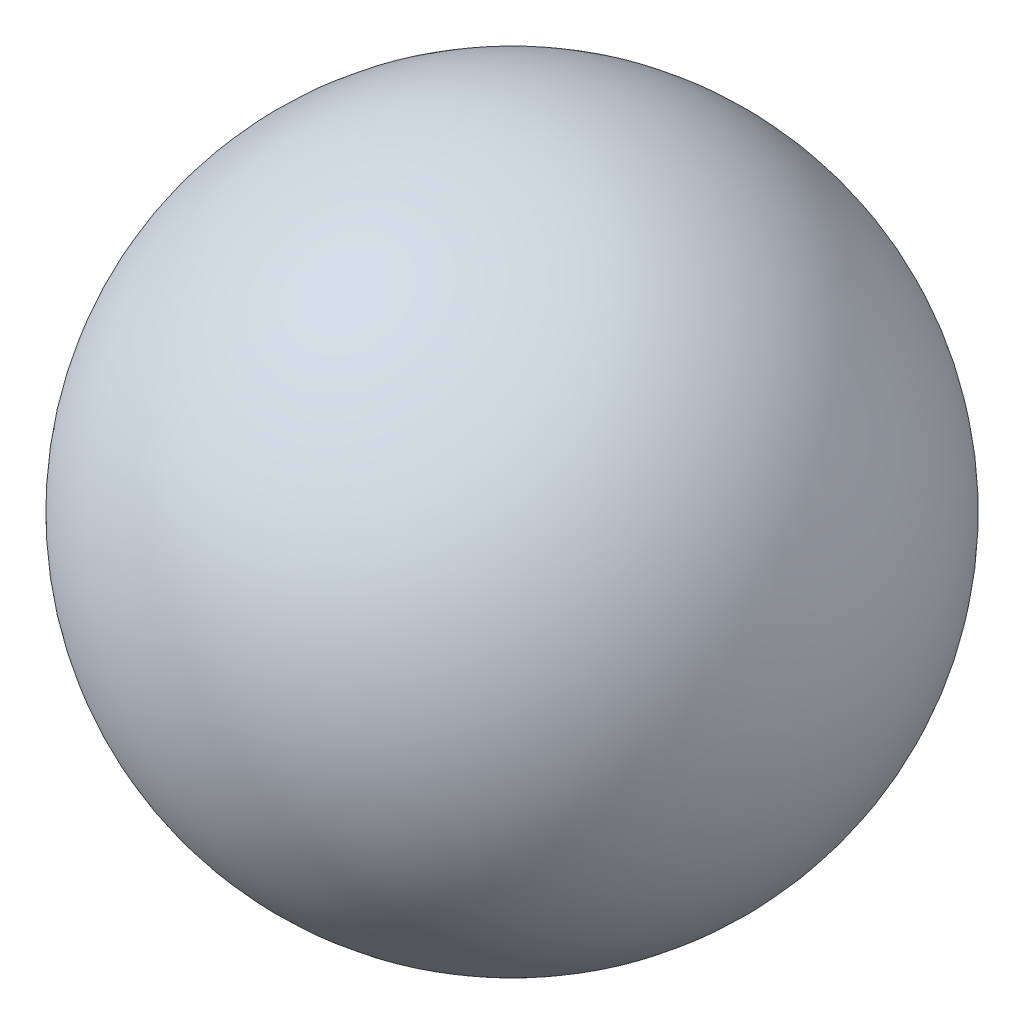
ISO-10303-21;
HEADER;
FILE_DESCRIPTION(('STEP AP214'),'2;1');
FILE_NAME('part.step','',(''),(''),'','','');
FILE_SCHEMA(('AUTOMOTIVE_DESIGN { 1 0 10303 214 1 1 1 1 }'));
ENDSEC;
DATA;
#1=APPLICATION_CONTEXT('core data for automotive mechanical design processes');
#2=APPLICATION_PROTOCOL_DEFINITION('international standard','automotive_design',2000,#1);
#3=PRODUCT_CONTEXT('',#1,'mechanical');
#4=PRODUCT('Part','Part','',(#3));
#5=PRODUCT_RELATED_PRODUCT_CATEGORY('part','',(#4));
#6=PRODUCT_DEFINITION_FORMATION('','',#4);
#7=PRODUCT_DEFINITION_CONTEXT('part definition',#1,'design');
#8=PRODUCT_DEFINITION('design','',#6,#7);
#9=PRODUCT_DEFINITION_SHAPE('','',#8);
#10=(LENGTH_UNIT() NAMED_UNIT(*) SI_UNIT(.MILLI.,.METRE.));
#11=(NAMED_UNIT(*) PLANE_ANGLE_UNIT() SI_UNIT($,.RADIAN.));
#12=(NAMED_UNIT(*) SI_UNIT($,.STERADIAN.) SOLID_ANGLE_UNIT());
#13=UNCERTAINTY_MEASURE_WITH_UNIT(LENGTH_MEASURE(1.E-05),#10,'distance_accuracy_value','');
#14=(GEOMETRIC_REPRESENTATION_CONTEXT(3) GLOBAL_UNCERTAINTY_ASSIGNED_CONTEXT((#13)) GLOBAL_UNIT_ASSIGNED_CONTEXT((#10,
#11,#12)) REPRESENTATION_CONTEXT('',''));
#15=CARTESIAN_POINT('',(0.,0.,0.));
#16=DIRECTION('',(0.,0.,1.));
#17=DIRECTION('',(1.,0.,0.));
#18=AXIS2_PLACEMENT_3D('',#15,#16,#17);
#19=CARTESIAN_POINT('',(0.,0.,0.));
#20=DIRECTION('',(0.,1.,0.));
#21=DIRECTION('',(1.,0.,0.));
#22=AXIS2_PLACEMENT_3D('',#19,#20,#21);
#23=SPHERICAL_SURFACE('',#22,16.9);
#24=CARTESIAN_POINT('',(0.,16.9,0.));
#25=VERTEX_POINT('',#24);
#26=VERTEX_LOOP('',#25);
#27=FACE_BOUND('',#26,.T.);
#28=ADVANCED_FACE('F29',(#27),#23,.T.);
#29=CLOSED_SHELL('',(#28));
#30=MANIFOLD_SOLID_BREP('B2',#29);
#31=ADVANCED_BREP_SHAPE_REPRESENTATION('',(#18,#30),#14);
#32=SHAPE_DEFINITION_REPRESENTATION(#9,#31);
ENDSEC;
END-ISO-10303-21;
